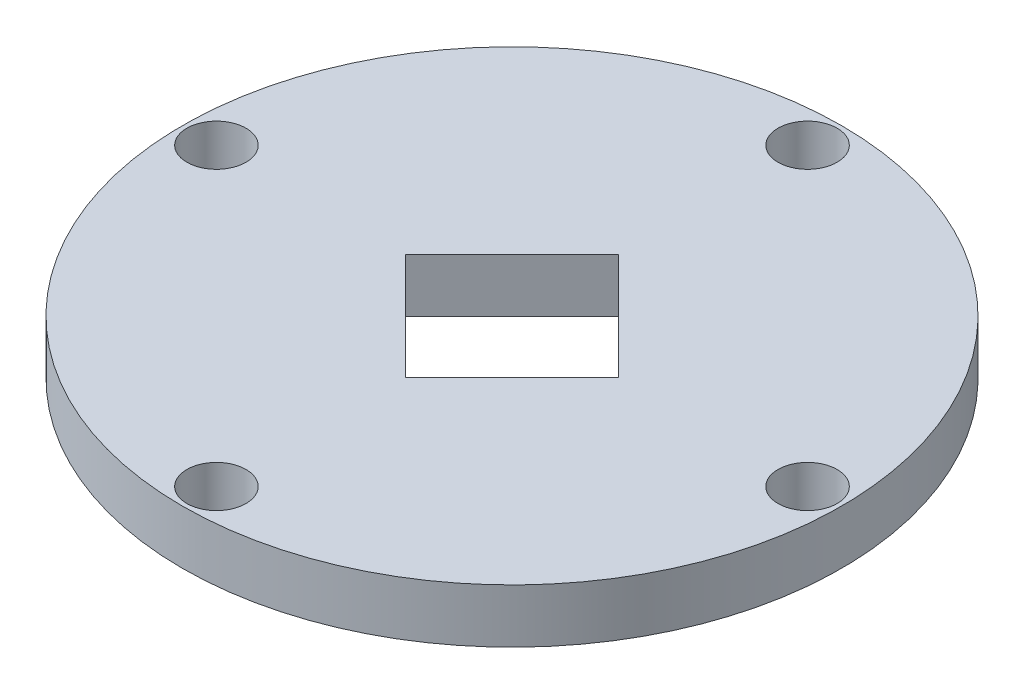
ISO-10303-21;
HEADER;
FILE_DESCRIPTION(('STEP AP214'),'2;1');
FILE_NAME('part.step','',(''),(''),'','','');
FILE_SCHEMA(('AUTOMOTIVE_DESIGN { 1 0 10303 214 1 1 1 1 }'));
ENDSEC;
DATA;
#1=APPLICATION_CONTEXT('core data for automotive mechanical design processes');
#2=APPLICATION_PROTOCOL_DEFINITION('international standard','automotive_design',2000,#1);
#3=PRODUCT_CONTEXT('',#1,'mechanical');
#4=PRODUCT('Part','Part','',(#3));
#5=PRODUCT_RELATED_PRODUCT_CATEGORY('part','',(#4));
#6=PRODUCT_DEFINITION_FORMATION('','',#4);
#7=PRODUCT_DEFINITION_CONTEXT('part definition',#1,'design');
#8=PRODUCT_DEFINITION('design','',#6,#7);
#9=PRODUCT_DEFINITION_SHAPE('','',#8);
#10=(LENGTH_UNIT() NAMED_UNIT(*) SI_UNIT(.MILLI.,.METRE.));
#11=(NAMED_UNIT(*) PLANE_ANGLE_UNIT() SI_UNIT($,.RADIAN.));
#12=(NAMED_UNIT(*) SI_UNIT($,.STERADIAN.) SOLID_ANGLE_UNIT());
#13=UNCERTAINTY_MEASURE_WITH_UNIT(LENGTH_MEASURE(1.E-05),#10,'distance_accuracy_value','');
#14=(GEOMETRIC_REPRESENTATION_CONTEXT(3) GLOBAL_UNCERTAINTY_ASSIGNED_CONTEXT((#13)) GLOBAL_UNIT_ASSIGNED_CONTEXT((#10,
#11,#12)) REPRESENTATION_CONTEXT('',''));
#15=CARTESIAN_POINT('',(0.,0.,0.));
#16=DIRECTION('',(0.,0.,1.));
#17=DIRECTION('',(1.,0.,0.));
#18=AXIS2_PLACEMENT_3D('',#15,#16,#17);
#19=CARTESIAN_POINT('',(3.60624458405139,3.65,3.6062445840514));
#20=DIRECTION('',(-0.707106781186546,0.,-0.707106781186549));
#21=DIRECTION('',(-0.707106781186549,0.,0.707106781186546));
#22=AXIS2_PLACEMENT_3D('',#19,#20,#21);
#23=PLANE('',#22);
#24=DIRECTION('',(0.707106781186549,0.,-0.707106781186546));
#25=VECTOR('',#24,1.);
#26=CARTESIAN_POINT('',(3.60624458405139,0.,3.6062445840514));
#27=LINE('',#26,#25);
#28=CARTESIAN_POINT('',(0.,0.,7.21248916810279));
#29=VERTEX_POINT('',#28);
#30=CARTESIAN_POINT('',(7.21248916810279,0.,0.));
#31=VERTEX_POINT('',#30);
#32=EDGE_CURVE('E103',#29,#31,#27,.T.);
#33=ORIENTED_EDGE('',*,*,#32,.F.);
#34=DIRECTION('',(0.,-1.,0.));
#35=VECTOR('',#34,1.);
#36=CARTESIAN_POINT('',(0.,3.65,7.21248916810279));
#37=LINE('',#36,#35);
#38=CARTESIAN_POINT('',(0.,3.65,7.21248916810279));
#39=VERTEX_POINT('',#38);
#40=EDGE_CURVE('E11',#39,#29,#37,.T.);
#41=ORIENTED_EDGE('',*,*,#40,.F.);
#42=DIRECTION('',(0.707106781186549,0.,-0.707106781186546));
#43=VECTOR('',#42,1.);
#44=CARTESIAN_POINT('',(3.60624458405139,3.65,3.6062445840514));
#45=LINE('',#44,#43);
#46=CARTESIAN_POINT('',(7.21248916810279,3.65,0.));
#47=VERTEX_POINT('',#46);
#48=EDGE_CURVE('E93',#39,#47,#45,.T.);
#49=ORIENTED_EDGE('',*,*,#48,.T.);
#50=DIRECTION('',(0.,-1.,0.));
#51=VECTOR('',#50,1.);
#52=CARTESIAN_POINT('',(7.21248916810279,3.65,0.));
#53=LINE('',#52,#51);
#54=EDGE_CURVE('E73',#47,#31,#53,.T.);
#55=ORIENTED_EDGE('',*,*,#54,.T.);
#56=EDGE_LOOP('',(#33,#41,#49,#55));
#57=FACE_BOUND('',#56,.T.);
#58=ADVANCED_FACE('F35',(#57),#23,.T.);
#59=CARTESIAN_POINT('',(-3.6062445840514,3.65,3.60624458405139));
#60=DIRECTION('',(0.707106781186549,0.,-0.707106781186546));
#61=DIRECTION('',(-0.707106781186546,0.,-0.707106781186549));
#62=AXIS2_PLACEMENT_3D('',#59,#60,#61);
#63=PLANE('',#62);
#64=DIRECTION('',(0.707106781186546,0.,0.707106781186549));
#65=VECTOR('',#64,1.);
#66=CARTESIAN_POINT('',(-3.6062445840514,0.,3.60624458405139));
#67=LINE('',#66,#65);
#68=CARTESIAN_POINT('',(-7.21248916810278,0.,0.));
#69=VERTEX_POINT('',#68);
#70=EDGE_CURVE('E86',#69,#29,#67,.T.);
#71=ORIENTED_EDGE('',*,*,#70,.F.);
#72=DIRECTION('',(0.,-1.,0.));
#73=VECTOR('',#72,1.);
#74=CARTESIAN_POINT('',(-7.21248916810278,3.65,0.));
#75=LINE('',#74,#73);
#76=CARTESIAN_POINT('',(-7.21248916810278,3.65,0.));
#77=VERTEX_POINT('',#76);
#78=EDGE_CURVE('E43',#77,#69,#75,.T.);
#79=ORIENTED_EDGE('',*,*,#78,.F.);
#80=DIRECTION('',(0.707106781186546,0.,0.707106781186549));
#81=VECTOR('',#80,1.);
#82=CARTESIAN_POINT('',(-3.6062445840514,3.65,3.60624458405139));
#83=LINE('',#82,#81);
#84=EDGE_CURVE('E84',#77,#39,#83,.T.);
#85=ORIENTED_EDGE('',*,*,#84,.T.);
#86=ORIENTED_EDGE('',*,*,#40,.T.);
#87=EDGE_LOOP('',(#71,#79,#85,#86));
#88=FACE_BOUND('',#87,.T.);
#89=ADVANCED_FACE('F82',(#88),#63,.T.);
#90=CARTESIAN_POINT('',(-3.60624458405139,3.65,-3.6062445840514));
#91=DIRECTION('',(-0.707106781186546,0.,-0.707106781186549));
#92=DIRECTION('',(-0.707106781186549,0.,0.707106781186546));
#93=AXIS2_PLACEMENT_3D('',#90,#91,#92);
#94=PLANE('',#93);
#95=DIRECTION('',(0.707106781186549,0.,-0.707106781186546));
#96=VECTOR('',#95,1.);
#97=CARTESIAN_POINT('',(-3.60624458405139,0.,-3.6062445840514));
#98=LINE('',#97,#96);
#99=CARTESIAN_POINT('',(0.,0.,-7.21248916810278));
#100=VERTEX_POINT('',#99);
#101=EDGE_CURVE('E66',#69,#100,#98,.T.);
#102=ORIENTED_EDGE('',*,*,#101,.T.);
#103=DIRECTION('',(0.,-1.,0.));
#104=VECTOR('',#103,1.);
#105=CARTESIAN_POINT('',(0.,3.65,-7.21248916810278));
#106=LINE('',#105,#104);
#107=CARTESIAN_POINT('',(0.,3.65,-7.21248916810278));
#108=VERTEX_POINT('',#107);
#109=EDGE_CURVE('E87',#108,#100,#106,.T.);
#110=ORIENTED_EDGE('',*,*,#109,.F.);
#111=DIRECTION('',(0.707106781186549,0.,-0.707106781186546));
#112=VECTOR('',#111,1.);
#113=CARTESIAN_POINT('',(-3.60624458405139,3.65,-3.6062445840514));
#114=LINE('',#113,#112);
#115=EDGE_CURVE('E88',#77,#108,#114,.T.);
#116=ORIENTED_EDGE('',*,*,#115,.F.);
#117=ORIENTED_EDGE('',*,*,#78,.T.);
#118=EDGE_LOOP('',(#102,#110,#116,#117));
#119=FACE_BOUND('',#118,.T.);
#120=ADVANCED_FACE('F89',(#119),#94,.F.);
#121=CARTESIAN_POINT('',(3.6062445840514,3.65,-3.60624458405139));
#122=DIRECTION('',(0.707106781186549,0.,-0.707106781186546));
#123=DIRECTION('',(-0.707106781186546,0.,-0.707106781186549));
#124=AXIS2_PLACEMENT_3D('',#121,#122,#123);
#125=PLANE('',#124);
#126=DIRECTION('',(0.707106781186546,0.,0.707106781186549));
#127=VECTOR('',#126,1.);
#128=CARTESIAN_POINT('',(3.6062445840514,0.,-3.60624458405139));
#129=LINE('',#128,#127);
#130=EDGE_CURVE('E109',#100,#31,#129,.T.);
#131=ORIENTED_EDGE('',*,*,#130,.T.);
#132=ORIENTED_EDGE('',*,*,#54,.F.);
#133=DIRECTION('',(0.707106781186546,0.,0.707106781186549));
#134=VECTOR('',#133,1.);
#135=CARTESIAN_POINT('',(3.6062445840514,3.65,-3.60624458405139));
#136=LINE('',#135,#134);
#137=EDGE_CURVE('E51',#108,#47,#136,.T.);
#138=ORIENTED_EDGE('',*,*,#137,.F.);
#139=ORIENTED_EDGE('',*,*,#109,.T.);
#140=EDGE_LOOP('',(#131,#132,#138,#139));
#141=FACE_BOUND('',#140,.T.);
#142=ADVANCED_FACE('F116',(#141),#125,.F.);
#143=CARTESIAN_POINT('',(0.,3.65,0.));
#144=DIRECTION('',(0.,-1.,0.));
#145=DIRECTION('',(0.,0.,-1.));
#146=AXIS2_PLACEMENT_3D('',#143,#144,#145);
#147=CYLINDRICAL_SURFACE('',#146,22.300536675);
#148=CARTESIAN_POINT('',(0.,3.65,0.));
#149=DIRECTION('',(0.,1.,0.));
#150=DIRECTION('',(0.,0.,1.));
#151=AXIS2_PLACEMENT_3D('',#148,#149,#150);
#152=CIRCLE('',#151,22.300536675);
#153=CARTESIAN_POINT('',(0.,3.65,22.300536675));
#154=VERTEX_POINT('',#153);
#155=EDGE_CURVE('E100',#154,#154,#152,.T.);
#156=ORIENTED_EDGE('',*,*,#155,.F.);
#157=EDGE_LOOP('',(#156));
#158=FACE_BOUND('',#157,.T.);
#159=CARTESIAN_POINT('',(0.,0.,0.));
#160=DIRECTION('',(0.,1.,0.));
#161=DIRECTION('',(0.,0.,1.));
#162=AXIS2_PLACEMENT_3D('',#159,#160,#161);
#163=CIRCLE('',#162,22.300536675);
#164=CARTESIAN_POINT('',(0.,0.,22.300536675));
#165=VERTEX_POINT('',#164);
#166=EDGE_CURVE('E95',#165,#165,#163,.T.);
#167=ORIENTED_EDGE('',*,*,#166,.T.);
#168=EDGE_LOOP('',(#167));
#169=FACE_BOUND('',#168,.T.);
#170=ADVANCED_FACE('F131',(#158,#169),#147,.T.);
#171=CARTESIAN_POINT('',(0.,3.65,0.));
#172=DIRECTION('',(0.,1.,0.));
#173=DIRECTION('',(0.,0.,1.));
#174=AXIS2_PLACEMENT_3D('',#171,#172,#173);
#175=PLANE('',#174);
#176=CARTESIAN_POINT('',(0.,3.65,-20.));
#177=DIRECTION('',(0.,1.,0.));
#178=DIRECTION('',(0.,0.,1.));
#179=AXIS2_PLACEMENT_3D('',#176,#177,#178);
#180=CIRCLE('',#179,2.);
#181=CARTESIAN_POINT('',(0.,3.65,-18.));
#182=VERTEX_POINT('',#181);
#183=EDGE_CURVE('E163',#182,#182,#180,.T.);
#184=ORIENTED_EDGE('',*,*,#183,.F.);
#185=EDGE_LOOP('',(#184));
#186=FACE_BOUND('',#185,.T.);
#187=CARTESIAN_POINT('',(20.0000000000006,3.65,-5.65984895009786E-13));
#188=DIRECTION('',(0.,1.,0.));
#189=DIRECTION('',(0.,0.,1.));
#190=AXIS2_PLACEMENT_3D('',#187,#188,#189);
#191=CIRCLE('',#190,2.00000000000044);
#192=CARTESIAN_POINT('',(20.0000000000006,3.65,1.99999999999988));
#193=VERTEX_POINT('',#192);
#194=EDGE_CURVE('E164',#193,#193,#191,.T.);
#195=ORIENTED_EDGE('',*,*,#194,.F.);
#196=EDGE_LOOP('',(#195));
#197=FACE_BOUND('',#196,.T.);
#198=CARTESIAN_POINT('',(1.13196979001957E-12,3.65,20.));
#199=DIRECTION('',(0.,1.,0.));
#200=DIRECTION('',(0.,0.,1.));
#201=AXIS2_PLACEMENT_3D('',#198,#199,#200);
#202=CIRCLE('',#201,2.00000000000122);
#203=CARTESIAN_POINT('',(1.13196979001957E-12,3.65,22.0000000000012));
#204=VERTEX_POINT('',#203);
#205=EDGE_CURVE('E173',#204,#204,#202,.T.);
#206=ORIENTED_EDGE('',*,*,#205,.F.);
#207=EDGE_LOOP('',(#206));
#208=FACE_BOUND('',#207,.T.);
#209=CARTESIAN_POINT('',(-19.9999999999994,3.65,5.6843418860808E-13));
#210=DIRECTION('',(0.,1.,0.));
#211=DIRECTION('',(0.,0.,1.));
#212=AXIS2_PLACEMENT_3D('',#209,#210,#211);
#213=CIRCLE('',#212,2.00000000000091);
#214=CARTESIAN_POINT('',(-19.9999999999994,3.65,2.00000000000148));
#215=VERTEX_POINT('',#214);
#216=EDGE_CURVE('E179',#215,#215,#213,.T.);
#217=ORIENTED_EDGE('',*,*,#216,.F.);
#218=EDGE_LOOP('',(#217));
#219=FACE_BOUND('',#218,.T.);
#220=ORIENTED_EDGE('',*,*,#48,.F.);
#221=ORIENTED_EDGE('',*,*,#84,.F.);
#222=ORIENTED_EDGE('',*,*,#115,.T.);
#223=ORIENTED_EDGE('',*,*,#137,.T.);
#224=EDGE_LOOP('',(#220,#221,#222,#223));
#225=FACE_BOUND('',#224,.T.);
#226=ORIENTED_EDGE('',*,*,#155,.T.);
#227=EDGE_LOOP('',(#226));
#228=FACE_BOUND('',#227,.T.);
#229=ADVANCED_FACE('F91',(#186,#197,#208,#219,#225,#228),#175,.T.);
#230=CARTESIAN_POINT('',(0.,0.,0.));
#231=DIRECTION('',(0.,1.,0.));
#232=DIRECTION('',(0.,0.,1.));
#233=AXIS2_PLACEMENT_3D('',#230,#231,#232);
#234=PLANE('',#233);
#235=CARTESIAN_POINT('',(0.,0.,-20.));
#236=DIRECTION('',(0.,1.,0.));
#237=DIRECTION('',(0.,0.,1.));
#238=AXIS2_PLACEMENT_3D('',#235,#236,#237);
#239=CIRCLE('',#238,2.);
#240=CARTESIAN_POINT('',(0.,0.,-18.));
#241=VERTEX_POINT('',#240);
#242=EDGE_CURVE('E106',#241,#241,#239,.T.);
#243=ORIENTED_EDGE('',*,*,#242,.T.);
#244=EDGE_LOOP('',(#243));
#245=FACE_BOUND('',#244,.T.);
#246=CARTESIAN_POINT('',(20.0000000000006,0.,-5.65984895009786E-13));
#247=DIRECTION('',(0.,1.,0.));
#248=DIRECTION('',(0.,0.,1.));
#249=AXIS2_PLACEMENT_3D('',#246,#247,#248);
#250=CIRCLE('',#249,2.00000000000044);
#251=CARTESIAN_POINT('',(20.0000000000006,0.,1.99999999999988));
#252=VERTEX_POINT('',#251);
#253=EDGE_CURVE('E168',#252,#252,#250,.T.);
#254=ORIENTED_EDGE('',*,*,#253,.T.);
#255=EDGE_LOOP('',(#254));
#256=FACE_BOUND('',#255,.T.);
#257=CARTESIAN_POINT('',(1.13196979001957E-12,0.,20.));
#258=DIRECTION('',(0.,1.,0.));
#259=DIRECTION('',(0.,0.,1.));
#260=AXIS2_PLACEMENT_3D('',#257,#258,#259);
#261=CIRCLE('',#260,2.00000000000122);
#262=CARTESIAN_POINT('',(1.13196979001957E-12,0.,22.0000000000012));
#263=VERTEX_POINT('',#262);
#264=EDGE_CURVE('E176',#263,#263,#261,.T.);
#265=ORIENTED_EDGE('',*,*,#264,.T.);
#266=EDGE_LOOP('',(#265));
#267=FACE_BOUND('',#266,.T.);
#268=CARTESIAN_POINT('',(-19.9999999999994,0.,5.6843418860808E-13));
#269=DIRECTION('',(0.,1.,0.));
#270=DIRECTION('',(0.,0.,1.));
#271=AXIS2_PLACEMENT_3D('',#268,#269,#270);
#272=CIRCLE('',#271,2.00000000000091);
#273=CARTESIAN_POINT('',(-19.9999999999994,0.,2.00000000000148));
#274=VERTEX_POINT('',#273);
#275=EDGE_CURVE('E181',#274,#274,#272,.T.);
#276=ORIENTED_EDGE('',*,*,#275,.T.);
#277=EDGE_LOOP('',(#276));
#278=FACE_BOUND('',#277,.T.);
#279=ORIENTED_EDGE('',*,*,#32,.T.);
#280=ORIENTED_EDGE('',*,*,#130,.F.);
#281=ORIENTED_EDGE('',*,*,#101,.F.);
#282=ORIENTED_EDGE('',*,*,#70,.T.);
#283=EDGE_LOOP('',(#279,#280,#281,#282));
#284=FACE_BOUND('',#283,.T.);
#285=ORIENTED_EDGE('',*,*,#166,.F.);
#286=EDGE_LOOP('',(#285));
#287=FACE_BOUND('',#286,.T.);
#288=ADVANCED_FACE('F118',(#245,#256,#267,#278,#284,#287),#234,.F.);
#289=CARTESIAN_POINT('',(-19.9999999999994,0.,5.6843418860808E-13));
#290=DIRECTION('',(0.,1.,0.));
#291=DIRECTION('',(0.,0.,1.));
#292=AXIS2_PLACEMENT_3D('',#289,#290,#291);
#293=CYLINDRICAL_SURFACE('',#292,2.00000000000091);
#294=ORIENTED_EDGE('',*,*,#275,.F.);
#295=EDGE_LOOP('',(#294));
#296=FACE_BOUND('',#295,.T.);
#297=ORIENTED_EDGE('',*,*,#216,.T.);
#298=EDGE_LOOP('',(#297));
#299=FACE_BOUND('',#298,.T.);
#300=ADVANCED_FACE('F137',(#296,#299),#293,.F.);
#301=CARTESIAN_POINT('',(1.13196979001957E-12,0.,20.));
#302=DIRECTION('',(0.,1.,0.));
#303=DIRECTION('',(0.,0.,1.));
#304=AXIS2_PLACEMENT_3D('',#301,#302,#303);
#305=CYLINDRICAL_SURFACE('',#304,2.00000000000122);
#306=ORIENTED_EDGE('',*,*,#264,.F.);
#307=EDGE_LOOP('',(#306));
#308=FACE_BOUND('',#307,.T.);
#309=ORIENTED_EDGE('',*,*,#205,.T.);
#310=EDGE_LOOP('',(#309));
#311=FACE_BOUND('',#310,.T.);
#312=ADVANCED_FACE('F144',(#308,#311),#305,.F.);
#313=CARTESIAN_POINT('',(20.0000000000006,0.,-5.65984895009786E-13));
#314=DIRECTION('',(0.,1.,0.));
#315=DIRECTION('',(0.,0.,1.));
#316=AXIS2_PLACEMENT_3D('',#313,#314,#315);
#317=CYLINDRICAL_SURFACE('',#316,2.00000000000044);
#318=ORIENTED_EDGE('',*,*,#253,.F.);
#319=EDGE_LOOP('',(#318));
#320=FACE_BOUND('',#319,.T.);
#321=ORIENTED_EDGE('',*,*,#194,.T.);
#322=EDGE_LOOP('',(#321));
#323=FACE_BOUND('',#322,.T.);
#324=ADVANCED_FACE('F148',(#320,#323),#317,.F.);
#325=CARTESIAN_POINT('',(0.,0.,-20.));
#326=DIRECTION('',(0.,1.,0.));
#327=DIRECTION('',(0.,0.,1.));
#328=AXIS2_PLACEMENT_3D('',#325,#326,#327);
#329=CYLINDRICAL_SURFACE('',#328,2.);
#330=ORIENTED_EDGE('',*,*,#242,.F.);
#331=EDGE_LOOP('',(#330));
#332=FACE_BOUND('',#331,.T.);
#333=ORIENTED_EDGE('',*,*,#183,.T.);
#334=EDGE_LOOP('',(#333));
#335=FACE_BOUND('',#334,.T.);
#336=ADVANCED_FACE('F152',(#332,#335),#329,.F.);
#337=CLOSED_SHELL('',(#58,#89,#120,#142,#170,#229,#288,#300,#312,#324,#336));
#338=MANIFOLD_SOLID_BREP('B2',#337);
#339=ADVANCED_BREP_SHAPE_REPRESENTATION('',(#18,#338),#14);
#340=SHAPE_DEFINITION_REPRESENTATION(#9,#339);
ENDSEC;
END-ISO-10303-21;
